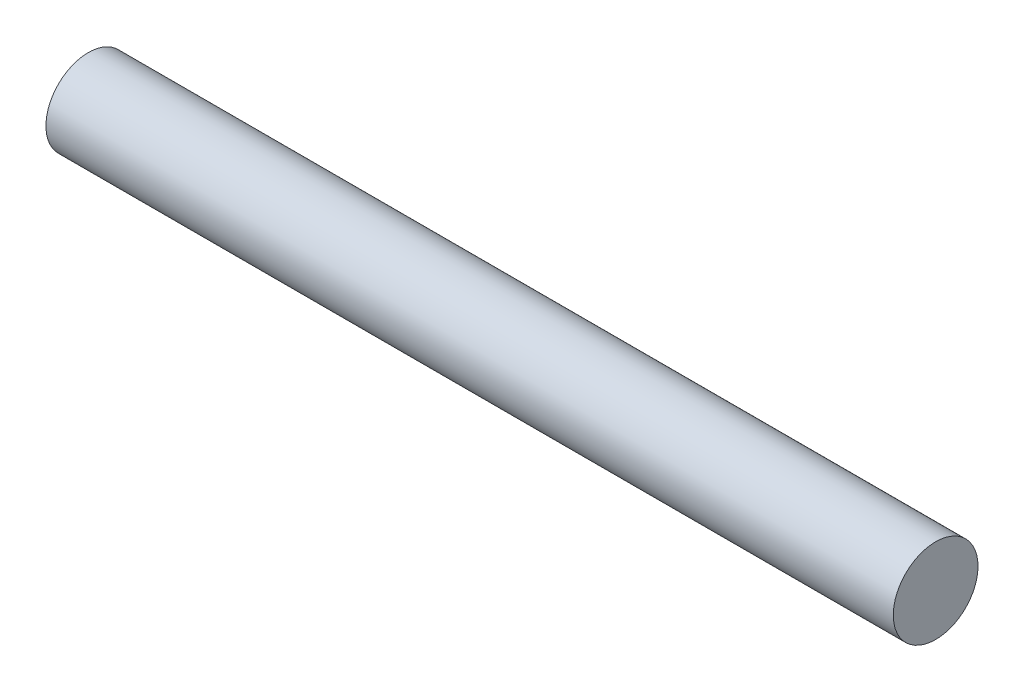
ISO-10303-21;
HEADER;
FILE_DESCRIPTION(('STEP AP214'),'2;1');
FILE_NAME('part.step','',(''),(''),'','','');
FILE_SCHEMA(('AUTOMOTIVE_DESIGN { 1 0 10303 214 1 1 1 1 }'));
ENDSEC;
DATA;
#1=APPLICATION_CONTEXT('core data for automotive mechanical design processes');
#2=APPLICATION_PROTOCOL_DEFINITION('international standard','automotive_design',2000,#1);
#3=PRODUCT_CONTEXT('',#1,'mechanical');
#4=PRODUCT('Part','Part','',(#3));
#5=PRODUCT_RELATED_PRODUCT_CATEGORY('part','',(#4));
#6=PRODUCT_DEFINITION_FORMATION('','',#4);
#7=PRODUCT_DEFINITION_CONTEXT('part definition',#1,'design');
#8=PRODUCT_DEFINITION('design','',#6,#7);
#9=PRODUCT_DEFINITION_SHAPE('','',#8);
#10=(LENGTH_UNIT() NAMED_UNIT(*) SI_UNIT(.MILLI.,.METRE.));
#11=(NAMED_UNIT(*) PLANE_ANGLE_UNIT() SI_UNIT($,.RADIAN.));
#12=(NAMED_UNIT(*) SI_UNIT($,.STERADIAN.) SOLID_ANGLE_UNIT());
#13=UNCERTAINTY_MEASURE_WITH_UNIT(LENGTH_MEASURE(1.E-05),#10,'distance_accuracy_value','');
#14=(GEOMETRIC_REPRESENTATION_CONTEXT(3) GLOBAL_UNCERTAINTY_ASSIGNED_CONTEXT((#13)) GLOBAL_UNIT_ASSIGNED_CONTEXT((#10,
#11,#12)) REPRESENTATION_CONTEXT('',''));
#15=CARTESIAN_POINT('',(0.,0.,0.));
#16=DIRECTION('',(0.,0.,1.));
#17=DIRECTION('',(1.,0.,0.));
#18=AXIS2_PLACEMENT_3D('',#15,#16,#17);
#19=CARTESIAN_POINT('',(50.,0.,0.));
#20=DIRECTION('',(-1.,0.,0.));
#21=DIRECTION('',(0.,0.,1.));
#22=AXIS2_PLACEMENT_3D('',#19,#20,#21);
#23=CYLINDRICAL_SURFACE('',#22,2.5);
#24=CARTESIAN_POINT('',(50.,0.,0.));
#25=DIRECTION('',(1.,0.,0.));
#26=DIRECTION('',(0.,0.,-1.));
#27=AXIS2_PLACEMENT_3D('',#24,#25,#26);
#28=CIRCLE('',#27,2.5);
#29=CARTESIAN_POINT('',(50.,0.,-2.5));
#30=VERTEX_POINT('',#29);
#31=EDGE_CURVE('E10',#30,#30,#28,.T.);
#32=ORIENTED_EDGE('',*,*,#31,.F.);
#33=EDGE_LOOP('',(#32));
#34=FACE_BOUND('',#33,.T.);
#35=CARTESIAN_POINT('',(0.,0.,0.));
#36=DIRECTION('',(1.,0.,0.));
#37=DIRECTION('',(0.,0.,-1.));
#38=AXIS2_PLACEMENT_3D('',#35,#36,#37);
#39=CIRCLE('',#38,2.5);
#40=CARTESIAN_POINT('',(0.,0.,-2.5));
#41=VERTEX_POINT('',#40);
#42=EDGE_CURVE('E40',#41,#41,#39,.T.);
#43=ORIENTED_EDGE('',*,*,#42,.T.);
#44=EDGE_LOOP('',(#43));
#45=FACE_BOUND('',#44,.T.);
#46=ADVANCED_FACE('F37',(#34,#45),#23,.T.);
#47=CARTESIAN_POINT('',(50.,0.,0.));
#48=DIRECTION('',(1.,0.,0.));
#49=DIRECTION('',(0.,0.,-1.));
#50=AXIS2_PLACEMENT_3D('',#47,#48,#49);
#51=PLANE('',#50);
#52=ORIENTED_EDGE('',*,*,#31,.T.);
#53=EDGE_LOOP('',(#52));
#54=FACE_BOUND('',#53,.T.);
#55=ADVANCED_FACE('F54',(#54),#51,.T.);
#56=CARTESIAN_POINT('',(0.,0.,0.));
#57=DIRECTION('',(1.,0.,0.));
#58=DIRECTION('',(0.,0.,-1.));
#59=AXIS2_PLACEMENT_3D('',#56,#57,#58);
#60=PLANE('',#59);
#61=ORIENTED_EDGE('',*,*,#42,.F.);
#62=EDGE_LOOP('',(#61));
#63=FACE_BOUND('',#62,.T.);
#64=ADVANCED_FACE('F52',(#63),#60,.F.);
#65=CLOSED_SHELL('',(#46,#55,#64));
#66=MANIFOLD_SOLID_BREP('B2',#65);
#67=ADVANCED_BREP_SHAPE_REPRESENTATION('',(#18,#66),#14);
#68=SHAPE_DEFINITION_REPRESENTATION(#9,#67);
ENDSEC;
END-ISO-10303-21;
